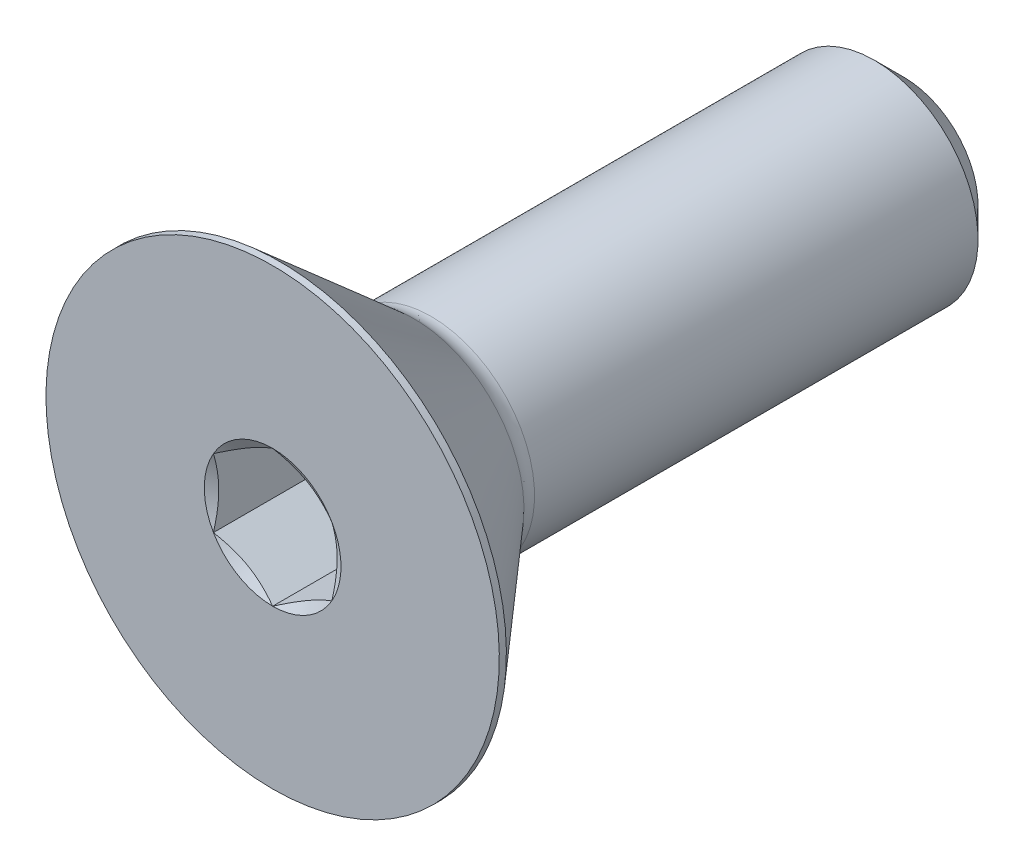
ISO-10303-21;
HEADER;
FILE_DESCRIPTION(('STEP AP214'),'2;1');
FILE_NAME('part.step','',(''),(''),'','','');
FILE_SCHEMA(('AUTOMOTIVE_DESIGN { 1 0 10303 214 1 1 1 1 }'));
ENDSEC;
DATA;
#1=APPLICATION_CONTEXT('core data for automotive mechanical design processes');
#2=APPLICATION_PROTOCOL_DEFINITION('international standard','automotive_design',2000,#1);
#3=PRODUCT_CONTEXT('',#1,'mechanical');
#4=PRODUCT('Part','Part','',(#3));
#5=PRODUCT_RELATED_PRODUCT_CATEGORY('part','',(#4));
#6=PRODUCT_DEFINITION_FORMATION('','',#4);
#7=PRODUCT_DEFINITION_CONTEXT('part definition',#1,'design');
#8=PRODUCT_DEFINITION('design','',#6,#7);
#9=PRODUCT_DEFINITION_SHAPE('','',#8);
#10=(LENGTH_UNIT() NAMED_UNIT(*) SI_UNIT(.MILLI.,.METRE.));
#11=(NAMED_UNIT(*) PLANE_ANGLE_UNIT() SI_UNIT($,.RADIAN.));
#12=(NAMED_UNIT(*) SI_UNIT($,.STERADIAN.) SOLID_ANGLE_UNIT());
#13=UNCERTAINTY_MEASURE_WITH_UNIT(LENGTH_MEASURE(1.E-05),#10,'distance_accuracy_value','');
#14=(GEOMETRIC_REPRESENTATION_CONTEXT(3) GLOBAL_UNCERTAINTY_ASSIGNED_CONTEXT((#13)) GLOBAL_UNIT_ASSIGNED_CONTEXT((#10,
#11,#12)) REPRESENTATION_CONTEXT('',''));
#15=CARTESIAN_POINT('',(0.,0.,0.));
#16=DIRECTION('',(0.,0.,1.));
#17=DIRECTION('',(1.,0.,0.));
#18=AXIS2_PLACEMENT_3D('',#15,#16,#17);
#19=CARTESIAN_POINT('',(0.,0.,-12.7));
#20=DIRECTION('',(0.,0.,-1.));
#21=DIRECTION('',(0.,1.,0.));
#22=AXIS2_PLACEMENT_3D('',#19,#20,#21);
#23=CYLINDRICAL_SURFACE('',#22,2.0828);
#24=CARTESIAN_POINT('',(0.,0.,-12.1046875));
#25=DIRECTION('',(0.,0.,-1.));
#26=DIRECTION('',(0.,1.,0.));
#27=AXIS2_PLACEMENT_3D('',#24,#25,#26);
#28=CIRCLE('',#27,2.0828);
#29=CARTESIAN_POINT('',(0.,2.0828,-12.1046875));
#30=VERTEX_POINT('',#29);
#31=EDGE_CURVE('E47',#30,#30,#28,.F.);
#32=ORIENTED_EDGE('',*,*,#31,.T.);
#33=EDGE_LOOP('',(#32));
#34=FACE_BOUND('',#33,.T.);
#35=CARTESIAN_POINT('',(0.,0.,-3.185013014405));
#36=DIRECTION('',(0.,0.,1.));
#37=DIRECTION('',(0.,-1.,0.));
#38=AXIS2_PLACEMENT_3D('',#35,#36,#37);
#39=CIRCLE('',#38,2.0828);
#40=CARTESIAN_POINT('',(0.,-2.0828,-3.18501301440499));
#41=VERTEX_POINT('',#40);
#42=EDGE_CURVE('E206',#41,#41,#39,.T.);
#43=ORIENTED_EDGE('',*,*,#42,.F.);
#44=EDGE_LOOP('',(#43));
#45=FACE_BOUND('',#44,.T.);
#46=ADVANCED_FACE('F34',(#34,#45),#23,.T.);
#47=CARTESIAN_POINT('',(0.,-2.0828,-12.7));
#48=DIRECTION('',(0.,0.,-1.));
#49=DIRECTION('',(0.,1.,0.));
#50=AXIS2_PLACEMENT_3D('',#47,#48,#49);
#51=PLANE('',#50);
#52=CARTESIAN_POINT('',(0.,0.,-12.7));
#53=DIRECTION('',(0.,0.,-1.));
#54=DIRECTION('',(0.,1.,0.));
#55=AXIS2_PLACEMENT_3D('',#52,#53,#54);
#56=CIRCLE('',#55,1.4874875);
#57=CARTESIAN_POINT('',(0.,1.4874875,-12.7));
#58=VERTEX_POINT('',#57);
#59=EDGE_CURVE('E209',#58,#58,#56,.T.);
#60=ORIENTED_EDGE('',*,*,#59,.T.);
#61=EDGE_LOOP('',(#60));
#62=FACE_BOUND('',#61,.T.);
#63=ADVANCED_FACE('F219',(#62),#51,.T.);
#64=CARTESIAN_POINT('',(0.,0.,-12.7));
#65=DIRECTION('',(0.,0.,1.));
#66=DIRECTION('',(0.,-1.,0.));
#67=AXIS2_PLACEMENT_3D('',#64,#65,#66);
#68=CONICAL_SURFACE('',#67,1.4874875,0.785398163397446);
#69=ORIENTED_EDGE('',*,*,#31,.F.);
#70=EDGE_LOOP('',(#69));
#71=FACE_BOUND('',#70,.T.);
#72=ORIENTED_EDGE('',*,*,#59,.F.);
#73=EDGE_LOOP('',(#72));
#74=FACE_BOUND('',#73,.T.);
#75=ADVANCED_FACE('F36',(#71,#74),#68,.T.);
#76=CARTESIAN_POINT('',(0.,0.,-3.185013014405));
#77=DIRECTION('',(0.,0.,1.));
#78=DIRECTION('',(0.,-1.,0.));
#79=AXIS2_PLACEMENT_3D('',#76,#77,#78);
#80=TOROIDAL_SURFACE('',#79,2.6013707373443,0.518570737344303);
#81=CARTESIAN_POINT('',(0.,0.,-2.8448));
#82=DIRECTION('',(0.,0.,1.));
#83=DIRECTION('',(0.,-1.,0.));
#84=AXIS2_PLACEMENT_3D('',#81,#82,#83);
#85=CIRCLE('',#84,2.21000043384737);
#86=CARTESIAN_POINT('',(0.,-2.21000043384737,-2.8448));
#87=VERTEX_POINT('',#86);
#88=EDGE_CURVE('E203',#87,#87,#85,.T.);
#89=ORIENTED_EDGE('',*,*,#88,.F.);
#90=EDGE_LOOP('',(#89));
#91=FACE_BOUND('',#90,.T.);
#92=ORIENTED_EDGE('',*,*,#42,.T.);
#93=EDGE_LOOP('',(#92));
#94=FACE_BOUND('',#93,.T.);
#95=ADVANCED_FACE('F218',(#91,#94),#80,.F.);
#96=CARTESIAN_POINT('',(0.,0.,-2.8448));
#97=DIRECTION('',(0.,0.,1.));
#98=DIRECTION('',(0.,-1.,0.));
#99=AXIS2_PLACEMENT_3D('',#96,#97,#98);
#100=CONICAL_SURFACE('',#99,2.21000043384737,0.715584993317677);
#101=CARTESIAN_POINT('',(0.,0.,-0.142239999999999));
#102=DIRECTION('',(0.,0.,1.));
#103=DIRECTION('',(0.,-1.,0.));
#104=AXIS2_PLACEMENT_3D('',#101,#102,#103);
#105=CIRCLE('',#104,4.5593);
#106=CARTESIAN_POINT('',(0.,-4.5593,-0.142239999999998));
#107=VERTEX_POINT('',#106);
#108=EDGE_CURVE('E200',#107,#107,#105,.T.);
#109=ORIENTED_EDGE('',*,*,#108,.F.);
#110=EDGE_LOOP('',(#109));
#111=FACE_BOUND('',#110,.T.);
#112=ORIENTED_EDGE('',*,*,#88,.T.);
#113=EDGE_LOOP('',(#112));
#114=FACE_BOUND('',#113,.T.);
#115=ADVANCED_FACE('F231',(#111,#114),#100,.T.);
#116=CARTESIAN_POINT('',(0.,0.,0.));
#117=DIRECTION('',(0.,0.,1.));
#118=DIRECTION('',(0.,-1.,0.));
#119=AXIS2_PLACEMENT_3D('',#116,#117,#118);
#120=CYLINDRICAL_SURFACE('',#119,4.5593);
#121=CARTESIAN_POINT('',(0.,0.,0.));
#122=DIRECTION('',(0.,0.,1.));
#123=DIRECTION('',(0.,-1.,0.));
#124=AXIS2_PLACEMENT_3D('',#121,#122,#123);
#125=CIRCLE('',#124,4.5593);
#126=CARTESIAN_POINT('',(0.,-4.5593,0.));
#127=VERTEX_POINT('',#126);
#128=EDGE_CURVE('E188',#127,#127,#125,.T.);
#129=ORIENTED_EDGE('',*,*,#128,.F.);
#130=EDGE_LOOP('',(#129));
#131=FACE_BOUND('',#130,.T.);
#132=ORIENTED_EDGE('',*,*,#108,.T.);
#133=EDGE_LOOP('',(#132));
#134=FACE_BOUND('',#133,.T.);
#135=ADVANCED_FACE('F163',(#131,#134),#120,.T.);
#136=CARTESIAN_POINT('',(0.,-2.0828,0.));
#137=DIRECTION('',(0.,0.,1.));
#138=DIRECTION('',(0.,-1.,0.));
#139=AXIS2_PLACEMENT_3D('',#136,#137,#138);
#140=PLANE('',#139);
#141=CARTESIAN_POINT('',(0.,0.,0.));
#142=DIRECTION('',(0.,0.,1.));
#143=DIRECTION('',(1.,0.,0.));
#144=AXIS2_PLACEMENT_3D('',#141,#142,#143);
#145=CIRCLE('',#144,1.3748153285078);
#146=CARTESIAN_POINT('',(0.,-1.3748153285078,0.));
#147=VERTEX_POINT('',#146);
#148=CARTESIAN_POINT('',(1.190625,-0.687407664253899,0.));
#149=VERTEX_POINT('',#148);
#150=EDGE_CURVE('E60',#147,#149,#145,.T.);
#151=ORIENTED_EDGE('',*,*,#150,.F.);
#152=CARTESIAN_POINT('',(-1.190625,-0.687407664253898,0.));
#153=VERTEX_POINT('',#152);
#154=EDGE_CURVE('E132',#153,#147,#145,.T.);
#155=ORIENTED_EDGE('',*,*,#154,.F.);
#156=CARTESIAN_POINT('',(-1.190625,0.687407664253899,0.));
#157=VERTEX_POINT('',#156);
#158=EDGE_CURVE('E131',#157,#153,#145,.T.);
#159=ORIENTED_EDGE('',*,*,#158,.F.);
#160=CARTESIAN_POINT('',(0.,1.3748153285078,0.));
#161=VERTEX_POINT('',#160);
#162=EDGE_CURVE('E101',#161,#157,#145,.T.);
#163=ORIENTED_EDGE('',*,*,#162,.F.);
#164=CARTESIAN_POINT('',(1.190625,0.687407664253899,0.));
#165=VERTEX_POINT('',#164);
#166=EDGE_CURVE('E92',#165,#161,#145,.T.);
#167=ORIENTED_EDGE('',*,*,#166,.F.);
#168=EDGE_CURVE('E53',#149,#165,#145,.T.);
#169=ORIENTED_EDGE('',*,*,#168,.F.);
#170=EDGE_LOOP('',(#151,#155,#159,#163,#167,#169));
#171=FACE_BOUND('',#170,.T.);
#172=ORIENTED_EDGE('',*,*,#128,.T.);
#173=EDGE_LOOP('',(#172));
#174=FACE_BOUND('',#173,.T.);
#175=ADVANCED_FACE('F127',(#171,#174),#140,.T.);
#176=CARTESIAN_POINT('',(0.,0.,0.));
#177=DIRECTION('',(0.,0.,1.));
#178=DIRECTION('',(1.,0.,0.));
#179=AXIS2_PLACEMENT_3D('',#176,#177,#178);
#180=CONICAL_SURFACE('',#179,1.3748153285078,1.0471975511966);
#181=ORIENTED_EDGE('',*,*,#162,.T.);
#182=CARTESIAN_POINT('',(0.000199999999999857,1.37493079856163,6.66750649111074E-05));
#183=CARTESIAN_POINT('',(-0.0521241335920578,1.34472144594715,-0.0173841088280572));
#184=CARTESIAN_POINT('',(-0.10489992088635,1.31425133094609,-0.0332555197402925));
#185=CARTESIAN_POINT('',(-0.211365548014192,1.25278337246439,-0.0609605102607296));
#186=CARTESIAN_POINT('',(-0.265057280958371,1.22178443599581,-0.0727842866431433));
#187=CARTESIAN_POINT('',(-0.371775270715523,1.16017077588214,-0.0911914732234389));
#188=CARTESIAN_POINT('',(-0.424785098452945,1.12956553756825,-0.097897363202722));
#189=CARTESIAN_POINT('',(-0.531054449254599,1.06821089927631,-0.105905839144113));
#190=CARTESIAN_POINT('',(-0.584313585518836,1.03746172261734,-0.107215053599669));
#191=CARTESIAN_POINT('',(-0.683848928687892,0.979994965444805,-0.104505505381765));
#192=CARTESIAN_POINT('',(-0.730139962493779,0.95326882461591,-0.10115203294612));
#193=CARTESIAN_POINT('',(-0.822420414320829,0.899990680912623,-0.0905191196442972));
#194=CARTESIAN_POINT('',(-0.868409512663248,0.873438862604839,-0.0832360392352406));
#195=CARTESIAN_POINT('',(-0.96088055159055,0.820050683387917,-0.0650271809382846));
#196=CARTESIAN_POINT('',(-1.00735077599471,0.79322108681887,-0.0540241416806252));
#197=CARTESIAN_POINT('',(-1.09959774541686,0.739962274191065,-0.0290509092233261));
#198=CARTESIAN_POINT('',(-1.14537567417661,0.713532374698681,-0.0150865918350895));
#199=CARTESIAN_POINT('',(-1.190825,0.687292194200061,6.66750649112451E-05));
#200=B_SPLINE_CURVE_WITH_KNOTS('',3,(#182,#183,#184,#185,#186,#187,#188,#189,#190,#191,#192,
#193,#194,#195,#196,#197,#198,#199),.UNSPECIFIED.,.F.,.F.,(4,2,2,2,2,2,2,2,4),(0.,
0.188739408275265,0.377932755052259,0.562442610563905,0.746725773280444,0.907244981861692,
1.06791311672804,1.23214725548008,1.39605851764637),.UNSPECIFIED.);
#201=EDGE_CURVE('E11',#161,#157,#200,.T.);
#202=ORIENTED_EDGE('',*,*,#201,.F.);
#203=EDGE_LOOP('',(#181,#202));
#204=FACE_BOUND('',#203,.T.);
#205=ADVANCED_FACE('F105',(#204),#180,.F.);
#206=ORIENTED_EDGE('',*,*,#158,.T.);
#207=CARTESIAN_POINT('',(-1.190625,-1.78015716020704,0.442716390655427));
#208=CARTESIAN_POINT('',(-1.190625,-1.72874189185983,0.4180488309547));
#209=CARTESIAN_POINT('',(-1.190625,-1.67720133899231,0.393638158506081));
#210=CARTESIAN_POINT('',(-1.190625,-1.57380296646994,0.345474583313673));
#211=CARTESIAN_POINT('',(-1.190625,-1.52194509174156,0.321721798946013));
#212=CARTESIAN_POINT('',(-1.190625,-1.41754804002315,0.274885294933137));
#213=CARTESIAN_POINT('',(-1.190625,-1.36500663843256,0.251806507884368));
#214=CARTESIAN_POINT('',(-1.190625,-1.25948270070629,0.206689244204313));
#215=CARTESIAN_POINT('',(-1.190625,-1.2065001876767,0.184650713481095));
#216=CARTESIAN_POINT('',(-1.190625,-1.04398470146779,0.119351436983341));
#217=CARTESIAN_POINT('',(-1.190625,-0.933604354597387,0.0781585999003275));
#218=CARTESIAN_POINT('',(-1.190625,-0.710006074690724,0.00485095661509208));
#219=CARTESIAN_POINT('',(-1.190625,-0.596796359427705,-0.0272874176672446));
#220=CARTESIAN_POINT('',(-1.190625,-0.424696051876903,-0.0645608123882066));
#221=CARTESIAN_POINT('',(-1.190625,-0.367003246478023,-0.0751581081193654));
#222=CARTESIAN_POINT('',(-1.190625,-0.25097045944064,-0.0919847698687185));
#223=CARTESIAN_POINT('',(-1.190625,-0.192630521807338,-0.0982144310601632));
#224=CARTESIAN_POINT('',(-1.190625,-0.0763262925494521,-0.105728713979273));
#225=CARTESIAN_POINT('',(-1.190625,-0.0183658752538236,-0.107071690688029));
#226=CARTESIAN_POINT('',(-1.190625,0.0974591062929179,-0.104854816676297));
#227=CARTESIAN_POINT('',(-1.190625,0.155323664386658,-0.101294662371037));
#228=CARTESIAN_POINT('',(-1.190625,0.29809590559866,-0.0867746349858032));
#229=CARTESIAN_POINT('',(-1.190625,0.382726930762758,-0.0730936626540098));
#230=CARTESIAN_POINT('',(-1.190625,0.550343213783403,-0.0378143916707683));
#231=CARTESIAN_POINT('',(-1.190625,0.633326360497145,-0.0162065507414982));
#232=CARTESIAN_POINT('',(-1.190625,0.75743678561691,0.0207049239269447));
#233=CARTESIAN_POINT('',(-1.190625,0.799205603652769,0.0339308547387371));
#234=CARTESIAN_POINT('',(-1.190625,0.882308453068415,0.0616061905506544));
#235=CARTESIAN_POINT('',(-1.190625,0.923642737930446,0.0760548320083953));
#236=CARTESIAN_POINT('',(-1.190625,1.00593175891306,0.105965752534517));
#237=CARTESIAN_POINT('',(-1.190625,1.04688656247483,0.12142784739001));
#238=CARTESIAN_POINT('',(-1.190625,1.12847345966589,0.153198427292469));
#239=CARTESIAN_POINT('',(-1.190625,1.1691054974264,0.169507055340327));
#240=CARTESIAN_POINT('',(-1.190625,1.27282063071651,0.212180273066304));
#241=CARTESIAN_POINT('',(-1.190625,1.33569634158372,0.239048362068021));
#242=CARTESIAN_POINT('',(-1.190625,1.46087997208419,0.294079740002463));
#243=CARTESIAN_POINT('',(-1.190625,1.52318784876136,0.322243125964506));
#244=CARTESIAN_POINT('',(-1.190625,1.70944892885062,0.40821962148726));
#245=CARTESIAN_POINT('',(-1.190625,1.83271877672913,0.467510254326272));
#246=CARTESIAN_POINT('',(-1.190625,2.07820533773844,0.58857815906779));
#247=CARTESIAN_POINT('',(-1.190625,2.20042056990702,0.650358398302133));
#248=CARTESIAN_POINT('',(-1.190625,2.44401368474694,0.775507444478736));
#249=CARTESIAN_POINT('',(-1.190625,2.56539167137775,0.83887604949749));
#250=CARTESIAN_POINT('',(-1.190625,2.79613899431499,0.960674727732887));
#251=CARTESIAN_POINT('',(-1.190625,2.90556045463822,1.01900639474909));
#252=CARTESIAN_POINT('',(-1.190625,3.12405139947394,1.13633435677135));
#253=CARTESIAN_POINT('',(-1.190625,3.23312087076723,1.1953306763737));
#254=CARTESIAN_POINT('',(-1.190625,3.45071155612092,1.31367057406643));
#255=CARTESIAN_POINT('',(-1.190625,3.55923345906017,1.37301288721241));
#256=CARTESIAN_POINT('',(-1.190625,3.77605786024419,1.49208374464986));
#257=CARTESIAN_POINT('',(-1.190625,3.88436036967376,1.55181226856633));
#258=CARTESIAN_POINT('',(-1.190625,3.99258405604319,1.61168241678741));
#259=B_SPLINE_CURVE_WITH_KNOTS('',3,(#207,#208,#209,#210,#211,#212,#213,#214,#215,#216,#217,
#218,#219,#220,#221,#222,#223,#224,#225,#226,#227,#228,#229,#230,#231,#232,#233,#234,#235,#236,
#237,#238,#239,#240,#241,#242,#243,#244,#245,#246,#247,#248,#249,#250,#251,#252,#253,#254,#255,
#256,#257,#258),.UNSPECIFIED.,.F.,.F.,(4,2,2,2,2,2,2,2,2,2,2,2,2,2,2,2,2,2,2,2,2,2,2,2,2,4),(0.,
0.171081312800698,0.342193211477217,0.514343080996251,0.686483989069504,1.03974142261425,
1.39207067467284,1.56790731618694,1.7437320731725,1.91745017490203,2.09117903313408,
2.34784044559531,2.60481184357443,2.73623569960086,2.86757808297636,2.99889665842932,
3.13023748956819,3.33534372136274,3.54046534255141,3.95077633549906,4.36159174218368,
4.7723551855675,5.144348223178,5.51635507236915,5.8874157094349,6.25845692794643),.UNSPECIFIED.);
#260=EDGE_CURVE('E100',#157,#153,#259,.F.);
#261=ORIENTED_EDGE('',*,*,#260,.F.);
#262=EDGE_LOOP('',(#206,#261));
#263=FACE_BOUND('',#262,.T.);
#264=ADVANCED_FACE('F259',(#263),#180,.F.);
#265=ORIENTED_EDGE('',*,*,#154,.T.);
#266=CARTESIAN_POINT('',(-1.190825,-0.68729219420006,6.66750649110584E-05));
#267=CARTESIAN_POINT('',(-1.13850086640794,-0.717501546814549,-0.0173841088280574));
#268=CARTESIAN_POINT('',(-1.08572507911365,-0.747971661815603,-0.0332555197402927));
#269=CARTESIAN_POINT('',(-0.979259451985808,-0.809439620297305,-0.0609605102607296));
#270=CARTESIAN_POINT('',(-0.925567719041629,-0.840438556765884,-0.0727842866431433));
#271=CARTESIAN_POINT('',(-0.818849729284477,-0.902052216879552,-0.091191473223439));
#272=CARTESIAN_POINT('',(-0.765839901547055,-0.932657455193448,-0.0978973632027222));
#273=CARTESIAN_POINT('',(-0.659570550745401,-0.994012093485389,-0.105905839144114));
#274=CARTESIAN_POINT('',(-0.606311414481164,-1.02476127014435,-0.107215053599669));
#275=CARTESIAN_POINT('',(-0.506776071312108,-1.08222802731689,-0.104505505381765));
#276=CARTESIAN_POINT('',(-0.460485037506222,-1.10895416814578,-0.10115203294612));
#277=CARTESIAN_POINT('',(-0.368204585679171,-1.16223231184907,-0.0905191196442975));
#278=CARTESIAN_POINT('',(-0.322215487336752,-1.18878413015686,-0.0832360392352409));
#279=CARTESIAN_POINT('',(-0.22974444840945,-1.24217230937378,-0.0650271809382851));
#280=CARTESIAN_POINT('',(-0.183274224005286,-1.26900190594282,-0.0540241416806257));
#281=CARTESIAN_POINT('',(-0.0910272545831363,-1.32226071857063,-0.0290509092233265));
#282=CARTESIAN_POINT('',(-0.0452493258233881,-1.34869061806301,-0.0150865918350898));
#283=CARTESIAN_POINT('',(0.000199999999999918,-1.37493079856163,6.66750649108695E-05));
#284=B_SPLINE_CURVE_WITH_KNOTS('',3,(#266,#267,#268,#269,#270,#271,#272,#273,#274,#275,#276,
#277,#278,#279,#280,#281,#282,#283),.UNSPECIFIED.,.F.,.F.,(4,2,2,2,2,2,2,2,4),(0.,
0.188739408275265,0.377932755052259,0.562442610563905,0.746725773280444,0.907244981861692,
1.06791311672804,1.23214725548008,1.39605851764637),.UNSPECIFIED.);
#285=EDGE_CURVE('E140',#153,#147,#284,.T.);
#286=ORIENTED_EDGE('',*,*,#285,.F.);
#287=EDGE_LOOP('',(#265,#286));
#288=FACE_BOUND('',#287,.T.);
#289=ADVANCED_FACE('F265',(#288),#180,.F.);
#290=ORIENTED_EDGE('',*,*,#150,.T.);
#291=CARTESIAN_POINT('',(-0.000199999999999964,-1.37493079856163,6.66750649109821E-05));
#292=CARTESIAN_POINT('',(0.0521241335920578,-1.34472144594715,-0.0173841088280574));
#293=CARTESIAN_POINT('',(0.10489992088635,-1.31425133094609,-0.0332555197402927));
#294=CARTESIAN_POINT('',(0.211365548014192,-1.25278337246439,-0.0609605102607297));
#295=CARTESIAN_POINT('',(0.265057280958371,-1.22178443599581,-0.0727842866431434));
#296=CARTESIAN_POINT('',(0.371775270715523,-1.16017077588214,-0.091191473223439));
#297=CARTESIAN_POINT('',(0.424785098452945,-1.12956553756825,-0.0978973632027222));
#298=CARTESIAN_POINT('',(0.531054449254599,-1.06821089927631,-0.105905839144113));
#299=CARTESIAN_POINT('',(0.584313585518835,-1.03746172261734,-0.107215053599669));
#300=CARTESIAN_POINT('',(0.683848928687892,-0.979994965444805,-0.104505505381765));
#301=CARTESIAN_POINT('',(0.730139962493778,-0.95326882461591,-0.10115203294612));
#302=CARTESIAN_POINT('',(0.822420414320829,-0.899990680912623,-0.0905191196442972));
#303=CARTESIAN_POINT('',(0.868409512663248,-0.873438862604839,-0.0832360392352407));
#304=CARTESIAN_POINT('',(0.96088055159055,-0.820050683387917,-0.0650271809382847));
#305=CARTESIAN_POINT('',(1.00735077599471,-0.79322108681887,-0.0540241416806253));
#306=CARTESIAN_POINT('',(1.09959774541686,-0.739962274191065,-0.0290509092233261));
#307=CARTESIAN_POINT('',(1.14537567417661,-0.713532374698681,-0.0150865918350894));
#308=CARTESIAN_POINT('',(1.190825,-0.687292194200061,6.66750649112454E-05));
#309=B_SPLINE_CURVE_WITH_KNOTS('',3,(#291,#292,#293,#294,#295,#296,#297,#298,#299,#300,#301,
#302,#303,#304,#305,#306,#307,#308),.UNSPECIFIED.,.F.,.F.,(4,2,2,2,2,2,2,2,4),(0.,
0.188739408275265,0.377932755052259,0.562442610563905,0.746725773280443,0.907244981861691,
1.06791311672804,1.23214725548008,1.39605851764637),.UNSPECIFIED.);
#310=EDGE_CURVE('E388',#147,#149,#309,.T.);
#311=ORIENTED_EDGE('',*,*,#310,.F.);
#312=EDGE_LOOP('',(#290,#311));
#313=FACE_BOUND('',#312,.T.);
#314=ADVANCED_FACE('F272',(#313),#180,.F.);
#315=ORIENTED_EDGE('',*,*,#168,.T.);
#316=CARTESIAN_POINT('',(1.190625,-1.78015716020704,0.442716390655427));
#317=CARTESIAN_POINT('',(1.190625,-1.72874189185983,0.4180488309547));
#318=CARTESIAN_POINT('',(1.190625,-1.67720133899231,0.393638158506081));
#319=CARTESIAN_POINT('',(1.190625,-1.57380296646994,0.345474583313673));
#320=CARTESIAN_POINT('',(1.190625,-1.52194509174156,0.321721798946013));
#321=CARTESIAN_POINT('',(1.190625,-1.41754804002315,0.274885294933137));
#322=CARTESIAN_POINT('',(1.190625,-1.36500663843256,0.251806507884367));
#323=CARTESIAN_POINT('',(1.190625,-1.25948270070629,0.206689244204313));
#324=CARTESIAN_POINT('',(1.190625,-1.2065001876767,0.184650713481095));
#325=CARTESIAN_POINT('',(1.190625,-1.04398470146779,0.119351436983341));
#326=CARTESIAN_POINT('',(1.190625,-0.933604354597387,0.0781585999003275));
#327=CARTESIAN_POINT('',(1.190625,-0.710006074690724,0.00485095661509212));
#328=CARTESIAN_POINT('',(1.190625,-0.596796359427705,-0.0272874176672445));
#329=CARTESIAN_POINT('',(1.190625,-0.424696051876903,-0.0645608123882065));
#330=CARTESIAN_POINT('',(1.190625,-0.367003246478023,-0.0751581081193653));
#331=CARTESIAN_POINT('',(1.190625,-0.25097045944064,-0.0919847698687185));
#332=CARTESIAN_POINT('',(1.190625,-0.192630521807338,-0.0982144310601632));
#333=CARTESIAN_POINT('',(1.190625,-0.0763262925494521,-0.105728713979273));
#334=CARTESIAN_POINT('',(1.190625,-0.0183658752538236,-0.107071690688029));
#335=CARTESIAN_POINT('',(1.190625,0.0974591062929179,-0.104854816676297));
#336=CARTESIAN_POINT('',(1.190625,0.155323664386658,-0.101294662371037));
#337=CARTESIAN_POINT('',(1.190625,0.29809590559866,-0.0867746349858032));
#338=CARTESIAN_POINT('',(1.190625,0.382726930762758,-0.0730936626540098));
#339=CARTESIAN_POINT('',(1.190625,0.550343213783402,-0.0378143916707685));
#340=CARTESIAN_POINT('',(1.190625,0.633326360497145,-0.0162065507414983));
#341=CARTESIAN_POINT('',(1.190625,0.75743678561691,0.0207049239269446));
#342=CARTESIAN_POINT('',(1.190625,0.799205603652768,0.0339308547387369));
#343=CARTESIAN_POINT('',(1.190625,0.882308453068415,0.0616061905506541));
#344=CARTESIAN_POINT('',(1.190625,0.923642737930445,0.076054832008395));
#345=CARTESIAN_POINT('',(1.190625,1.00593175891306,0.105965752534517));
#346=CARTESIAN_POINT('',(1.190625,1.04688656247483,0.12142784739001));
#347=CARTESIAN_POINT('',(1.190625,1.12847345966589,0.153198427292469));
#348=CARTESIAN_POINT('',(1.190625,1.1691054974264,0.169507055340326));
#349=CARTESIAN_POINT('',(1.190625,1.27282063071651,0.212180273066304));
#350=CARTESIAN_POINT('',(1.190625,1.33569634158372,0.239048362068021));
#351=CARTESIAN_POINT('',(1.190625,1.46087997208419,0.294079740002462));
#352=CARTESIAN_POINT('',(1.190625,1.52318784876136,0.322243125964506));
#353=CARTESIAN_POINT('',(1.190625,1.70944892885062,0.408219621487261));
#354=CARTESIAN_POINT('',(1.190625,1.83271877672913,0.467510254326272));
#355=CARTESIAN_POINT('',(1.190625,2.07820533773844,0.588578159067791));
#356=CARTESIAN_POINT('',(1.190625,2.20042056990702,0.650358398302133));
#357=CARTESIAN_POINT('',(1.190625,2.44401368474694,0.775507444478736));
#358=CARTESIAN_POINT('',(1.190625,2.56539167137775,0.83887604949749));
#359=CARTESIAN_POINT('',(1.190625,2.79613899431499,0.960674727732887));
#360=CARTESIAN_POINT('',(1.190625,2.90556045463822,1.01900639474909));
#361=CARTESIAN_POINT('',(1.190625,3.12405139947394,1.13633435677135));
#362=CARTESIAN_POINT('',(1.190625,3.23312087076723,1.1953306763737));
#363=CARTESIAN_POINT('',(1.190625,3.45071155612092,1.31367057406643));
#364=CARTESIAN_POINT('',(1.190625,3.55923345906017,1.37301288721241));
#365=CARTESIAN_POINT('',(1.190625,3.77605786024419,1.49208374464985));
#366=CARTESIAN_POINT('',(1.190625,3.88436036967376,1.55181226856633));
#367=CARTESIAN_POINT('',(1.190625,3.99258405604319,1.61168241678741));
#368=B_SPLINE_CURVE_WITH_KNOTS('',3,(#316,#317,#318,#319,#320,#321,#322,#323,#324,#325,#326,
#327,#328,#329,#330,#331,#332,#333,#334,#335,#336,#337,#338,#339,#340,#341,#342,#343,#344,#345,
#346,#347,#348,#349,#350,#351,#352,#353,#354,#355,#356,#357,#358,#359,#360,#361,#362,#363,#364,
#365,#366,#367),.UNSPECIFIED.,.F.,.F.,(4,2,2,2,2,2,2,2,2,2,2,2,2,2,2,2,2,2,2,2,2,2,2,2,2,4),(0.,
0.171081312800698,0.342193211477217,0.514343080996251,0.686483989069504,1.03974142261425,
1.39207067467284,1.56790731618694,1.7437320731725,1.91745017490203,2.09117903313408,
2.34784044559531,2.60481184357443,2.73623569960086,2.86757808297636,2.99889665842932,
3.13023748956819,3.33534372136274,3.54046534255141,3.95077633549906,4.36159174218368,
4.7723551855675,5.144348223178,5.51635507236916,5.8874157094349,6.25845692794643),.UNSPECIFIED.);
#369=EDGE_CURVE('E117',#149,#165,#368,.T.);
#370=ORIENTED_EDGE('',*,*,#369,.F.);
#371=EDGE_LOOP('',(#315,#370));
#372=FACE_BOUND('',#371,.T.);
#373=ADVANCED_FACE('F279',(#372),#180,.F.);
#374=ORIENTED_EDGE('',*,*,#166,.T.);
#375=CARTESIAN_POINT('',(1.190825,0.687292194200061,6.6675064911434E-05));
#376=CARTESIAN_POINT('',(1.13850086640794,0.71750154681455,-0.0173841088280571));
#377=CARTESIAN_POINT('',(1.08572507911365,0.747971661815604,-0.0332555197402924));
#378=CARTESIAN_POINT('',(0.979259451985808,0.809439620297306,-0.0609605102607294));
#379=CARTESIAN_POINT('',(0.925567719041629,0.840438556765884,-0.072784286643143));
#380=CARTESIAN_POINT('',(0.818849729284477,0.902052216879552,-0.0911914732234387));
#381=CARTESIAN_POINT('',(0.765839901547055,0.932657455193448,-0.0978973632027219));
#382=CARTESIAN_POINT('',(0.659570550745401,0.99401209348539,-0.105905839144113));
#383=CARTESIAN_POINT('',(0.606311414481164,1.02476127014435,-0.107215053599669));
#384=CARTESIAN_POINT('',(0.506776071312108,1.08222802731689,-0.104505505381765));
#385=CARTESIAN_POINT('',(0.460485037506222,1.10895416814578,-0.10115203294612));
#386=CARTESIAN_POINT('',(0.368204585679171,1.16223231184907,-0.0905191196442972));
#387=CARTESIAN_POINT('',(0.322215487336752,1.18878413015686,-0.0832360392352407));
#388=CARTESIAN_POINT('',(0.22974444840945,1.24217230937378,-0.0650271809382848));
#389=CARTESIAN_POINT('',(0.183274224005286,1.26900190594283,-0.0540241416806254));
#390=CARTESIAN_POINT('',(0.0910272545831362,1.32226071857063,-0.0290509092233262));
#391=CARTESIAN_POINT('',(0.045249325823388,1.34869061806301,-0.0150865918350896));
#392=CARTESIAN_POINT('',(-0.00020000000000008,1.37493079856163,6.66750649109952E-05));
#393=B_SPLINE_CURVE_WITH_KNOTS('',3,(#375,#376,#377,#378,#379,#380,#381,#382,#383,#384,#385,
#386,#387,#388,#389,#390,#391,#392),.UNSPECIFIED.,.F.,.F.,(4,2,2,2,2,2,2,2,4),(0.,
0.188739408275266,0.377932755052259,0.562442610563905,0.746725773280444,0.907244981861692,
1.06791311672804,1.23214725548008,1.39605851764637),.UNSPECIFIED.);
#394=EDGE_CURVE('E96',#165,#161,#393,.T.);
#395=ORIENTED_EDGE('',*,*,#394,.F.);
#396=EDGE_LOOP('',(#374,#395));
#397=FACE_BOUND('',#396,.T.);
#398=ADVANCED_FACE('F94',(#397),#180,.F.);
#399=CARTESIAN_POINT('',(0.,1.3748153285078,-1.99136));
#400=DIRECTION('',(0.,0.,1.));
#401=DIRECTION('',(1.,0.,0.));
#402=AXIS2_PLACEMENT_3D('',#399,#400,#401);
#403=PLANE('',#402);
#404=DIRECTION('',(-0.866025403784439,0.5,0.));
#405=VECTOR('',#404,1.);
#406=CARTESIAN_POINT('',(1.190625,0.687407664253899,-1.99136));
#407=LINE('',#406,#405);
#408=CARTESIAN_POINT('',(1.190625,0.687407664253899,-1.99136));
#409=VERTEX_POINT('',#408);
#410=CARTESIAN_POINT('',(0.,1.3748153285078,-1.99136));
#411=VERTEX_POINT('',#410);
#412=EDGE_CURVE('E116',#409,#411,#407,.T.);
#413=ORIENTED_EDGE('',*,*,#412,.T.);
#414=DIRECTION('',(-0.866025403784439,-0.5,0.));
#415=VECTOR('',#414,1.);
#416=CARTESIAN_POINT('',(0.,1.3748153285078,-1.99136));
#417=LINE('',#416,#415);
#418=CARTESIAN_POINT('',(-1.190625,0.687407664253899,-1.99136));
#419=VERTEX_POINT('',#418);
#420=EDGE_CURVE('E121',#411,#419,#417,.T.);
#421=ORIENTED_EDGE('',*,*,#420,.T.);
#422=DIRECTION('',(0.,-1.,0.));
#423=VECTOR('',#422,1.);
#424=CARTESIAN_POINT('',(-1.190625,0.687407664253899,-1.99136));
#425=LINE('',#424,#423);
#426=CARTESIAN_POINT('',(-1.190625,-0.687407664253898,-1.99136));
#427=VERTEX_POINT('',#426);
#428=EDGE_CURVE('E176',#419,#427,#425,.T.);
#429=ORIENTED_EDGE('',*,*,#428,.T.);
#430=DIRECTION('',(0.866025403784439,-0.5,0.));
#431=VECTOR('',#430,1.);
#432=CARTESIAN_POINT('',(-1.190625,-0.687407664253898,-1.99136));
#433=LINE('',#432,#431);
#434=CARTESIAN_POINT('',(0.,-1.3748153285078,-1.99136));
#435=VERTEX_POINT('',#434);
#436=EDGE_CURVE('E179',#427,#435,#433,.T.);
#437=ORIENTED_EDGE('',*,*,#436,.T.);
#438=DIRECTION('',(0.866025403784439,0.5,0.));
#439=VECTOR('',#438,1.);
#440=CARTESIAN_POINT('',(0.,-1.3748153285078,-1.99136));
#441=LINE('',#440,#439);
#442=CARTESIAN_POINT('',(1.190625,-0.687407664253899,-1.99136));
#443=VERTEX_POINT('',#442);
#444=EDGE_CURVE('E182',#435,#443,#441,.T.);
#445=ORIENTED_EDGE('',*,*,#444,.T.);
#446=DIRECTION('',(0.,1.,0.));
#447=VECTOR('',#446,1.);
#448=CARTESIAN_POINT('',(1.190625,-0.687407664253899,-1.99136));
#449=LINE('',#448,#447);
#450=EDGE_CURVE('E124',#443,#409,#449,.T.);
#451=ORIENTED_EDGE('',*,*,#450,.T.);
#452=EDGE_LOOP('',(#413,#421,#429,#437,#445,#451));
#453=FACE_BOUND('',#452,.T.);
#454=ADVANCED_FACE('F158',(#453),#403,.T.);
#455=CARTESIAN_POINT('',(0.,1.3748153285078,-1.99136));
#456=DIRECTION('',(-0.5,0.866025403784439,0.));
#457=DIRECTION('',(-0.866025403784439,-0.5,0.));
#458=AXIS2_PLACEMENT_3D('',#455,#456,#457);
#459=PLANE('',#458);
#460=DIRECTION('',(0.,0.,1.));
#461=VECTOR('',#460,1.);
#462=CARTESIAN_POINT('',(0.,1.3748153285078,-1.99136));
#463=LINE('',#462,#461);
#464=EDGE_CURVE('E113',#411,#161,#463,.T.);
#465=ORIENTED_EDGE('',*,*,#464,.T.);
#466=ORIENTED_EDGE('',*,*,#201,.T.);
#467=DIRECTION('',(0.,0.,1.));
#468=VECTOR('',#467,1.);
#469=CARTESIAN_POINT('',(-1.190625,0.687407664253899,-1.99136));
#470=LINE('',#469,#468);
#471=EDGE_CURVE('E123',#419,#157,#470,.T.);
#472=ORIENTED_EDGE('',*,*,#471,.F.);
#473=ORIENTED_EDGE('',*,*,#420,.F.);
#474=EDGE_LOOP('',(#465,#466,#472,#473));
#475=FACE_BOUND('',#474,.T.);
#476=ADVANCED_FACE('F119',(#475),#459,.F.);
#477=CARTESIAN_POINT('',(-1.190625,0.687407664253899,-1.99136));
#478=DIRECTION('',(-1.,0.,0.));
#479=DIRECTION('',(0.,-1.,0.));
#480=AXIS2_PLACEMENT_3D('',#477,#478,#479);
#481=PLANE('',#480);
#482=ORIENTED_EDGE('',*,*,#471,.T.);
#483=ORIENTED_EDGE('',*,*,#260,.T.);
#484=DIRECTION('',(0.,0.,1.));
#485=VECTOR('',#484,1.);
#486=CARTESIAN_POINT('',(-1.190625,-0.687407664253898,-1.99136));
#487=LINE('',#486,#485);
#488=EDGE_CURVE('E195',#427,#153,#487,.T.);
#489=ORIENTED_EDGE('',*,*,#488,.F.);
#490=ORIENTED_EDGE('',*,*,#428,.F.);
#491=EDGE_LOOP('',(#482,#483,#489,#490));
#492=FACE_BOUND('',#491,.T.);
#493=ADVANCED_FACE('F148',(#492),#481,.F.);
#494=CARTESIAN_POINT('',(-1.190625,-0.687407664253898,-1.99136));
#495=DIRECTION('',(-0.5,-0.866025403784439,0.));
#496=DIRECTION('',(0.866025403784439,-0.5,0.));
#497=AXIS2_PLACEMENT_3D('',#494,#495,#496);
#498=PLANE('',#497);
#499=ORIENTED_EDGE('',*,*,#488,.T.);
#500=ORIENTED_EDGE('',*,*,#285,.T.);
#501=DIRECTION('',(0.,0.,1.));
#502=VECTOR('',#501,1.);
#503=CARTESIAN_POINT('',(0.,-1.3748153285078,-1.99136));
#504=LINE('',#503,#502);
#505=EDGE_CURVE('E192',#435,#147,#504,.T.);
#506=ORIENTED_EDGE('',*,*,#505,.F.);
#507=ORIENTED_EDGE('',*,*,#436,.F.);
#508=EDGE_LOOP('',(#499,#500,#506,#507));
#509=FACE_BOUND('',#508,.T.);
#510=ADVANCED_FACE('F151',(#509),#498,.F.);
#511=CARTESIAN_POINT('',(0.,-1.3748153285078,-1.99136));
#512=DIRECTION('',(0.5,-0.866025403784439,0.));
#513=DIRECTION('',(0.866025403784439,0.5,0.));
#514=AXIS2_PLACEMENT_3D('',#511,#512,#513);
#515=PLANE('',#514);
#516=ORIENTED_EDGE('',*,*,#505,.T.);
#517=ORIENTED_EDGE('',*,*,#310,.T.);
#518=DIRECTION('',(0.,0.,1.));
#519=VECTOR('',#518,1.);
#520=CARTESIAN_POINT('',(1.190625,-0.687407664253899,-1.99136));
#521=LINE('',#520,#519);
#522=EDGE_CURVE('E189',#443,#149,#521,.T.);
#523=ORIENTED_EDGE('',*,*,#522,.F.);
#524=ORIENTED_EDGE('',*,*,#444,.F.);
#525=EDGE_LOOP('',(#516,#517,#523,#524));
#526=FACE_BOUND('',#525,.T.);
#527=ADVANCED_FACE('F308',(#526),#515,.F.);
#528=CARTESIAN_POINT('',(1.190625,-0.687407664253899,-1.99136));
#529=DIRECTION('',(1.,0.,0.));
#530=DIRECTION('',(0.,0.,-1.));
#531=AXIS2_PLACEMENT_3D('',#528,#529,#530);
#532=PLANE('',#531);
#533=ORIENTED_EDGE('',*,*,#522,.T.);
#534=ORIENTED_EDGE('',*,*,#369,.T.);
#535=DIRECTION('',(0.,0.,1.));
#536=VECTOR('',#535,1.);
#537=CARTESIAN_POINT('',(1.190625,0.687407664253899,-1.99136));
#538=LINE('',#537,#536);
#539=EDGE_CURVE('E115',#409,#165,#538,.T.);
#540=ORIENTED_EDGE('',*,*,#539,.F.);
#541=ORIENTED_EDGE('',*,*,#450,.F.);
#542=EDGE_LOOP('',(#533,#534,#540,#541));
#543=FACE_BOUND('',#542,.T.);
#544=ADVANCED_FACE('F162',(#543),#532,.F.);
#545=CARTESIAN_POINT('',(1.190625,0.687407664253899,-1.99136));
#546=DIRECTION('',(0.5,0.866025403784439,0.));
#547=DIRECTION('',(-0.866025403784439,0.5,0.));
#548=AXIS2_PLACEMENT_3D('',#545,#546,#547);
#549=PLANE('',#548);
#550=ORIENTED_EDGE('',*,*,#539,.T.);
#551=ORIENTED_EDGE('',*,*,#394,.T.);
#552=ORIENTED_EDGE('',*,*,#464,.F.);
#553=ORIENTED_EDGE('',*,*,#412,.F.);
#554=EDGE_LOOP('',(#550,#551,#552,#553));
#555=FACE_BOUND('',#554,.T.);
#556=ADVANCED_FACE('F111',(#555),#549,.F.);
#557=CLOSED_SHELL('',(#46,#63,#75,#95,#115,#135,#175,#205,#264,#289,#314,#373,#398,#454,#476,
#493,#510,#527,#544,#556));
#558=MANIFOLD_SOLID_BREP('B2',#557);
#559=ADVANCED_BREP_SHAPE_REPRESENTATION('',(#18,#558),#14);
#560=SHAPE_DEFINITION_REPRESENTATION(#9,#559);
ENDSEC;
END-ISO-10303-21;
